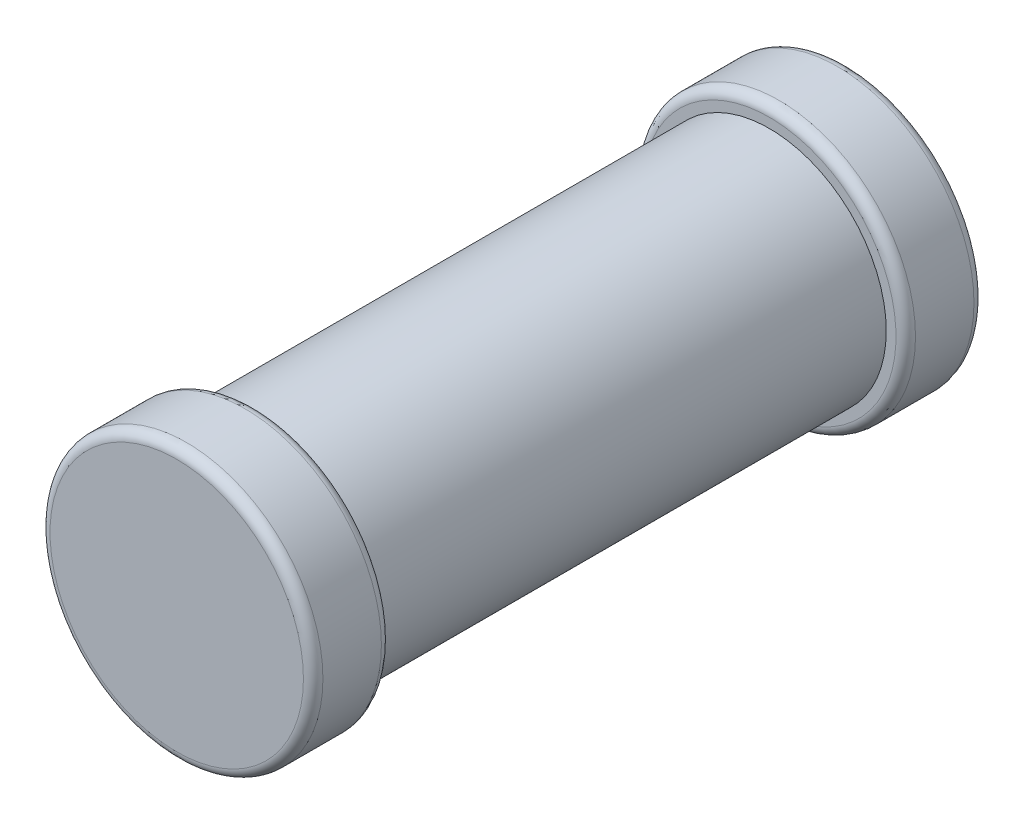
ISO-10303-21;
HEADER;
FILE_DESCRIPTION(('STEP AP214'),'2;1');
FILE_NAME('part.step','',(''),(''),'','','');
FILE_SCHEMA(('AUTOMOTIVE_DESIGN { 1 0 10303 214 1 1 1 1 }'));
ENDSEC;
DATA;
#1=APPLICATION_CONTEXT('core data for automotive mechanical design processes');
#2=APPLICATION_PROTOCOL_DEFINITION('international standard','automotive_design',2000,#1);
#3=PRODUCT_CONTEXT('',#1,'mechanical');
#4=PRODUCT('Part','Part','',(#3));
#5=PRODUCT_RELATED_PRODUCT_CATEGORY('part','',(#4));
#6=PRODUCT_DEFINITION_FORMATION('','',#4);
#7=PRODUCT_DEFINITION_CONTEXT('part definition',#1,'design');
#8=PRODUCT_DEFINITION('design','',#6,#7);
#9=PRODUCT_DEFINITION_SHAPE('','',#8);
#10=(LENGTH_UNIT() NAMED_UNIT(*) SI_UNIT(.MILLI.,.METRE.));
#11=(NAMED_UNIT(*) PLANE_ANGLE_UNIT() SI_UNIT($,.RADIAN.));
#12=(NAMED_UNIT(*) SI_UNIT($,.STERADIAN.) SOLID_ANGLE_UNIT());
#13=UNCERTAINTY_MEASURE_WITH_UNIT(LENGTH_MEASURE(1.E-05),#10,'distance_accuracy_value','');
#14=(GEOMETRIC_REPRESENTATION_CONTEXT(3) GLOBAL_UNCERTAINTY_ASSIGNED_CONTEXT((#13)) GLOBAL_UNIT_ASSIGNED_CONTEXT((#10,
#11,#12)) REPRESENTATION_CONTEXT('',''));
#15=CARTESIAN_POINT('',(0.,0.,0.));
#16=DIRECTION('',(0.,0.,1.));
#17=DIRECTION('',(1.,0.,0.));
#18=AXIS2_PLACEMENT_3D('',#15,#16,#17);
#19=CARTESIAN_POINT('',(0.,0.,-1.32));
#20=DIRECTION('',(0.,0.,1.));
#21=DIRECTION('',(1.,0.,0.));
#22=AXIS2_PLACEMENT_3D('',#19,#20,#21);
#23=CYLINDRICAL_SURFACE('',#22,0.6);
#24=CARTESIAN_POINT('',(0.,0.,-1.32));
#25=DIRECTION('',(0.,0.,-1.));
#26=DIRECTION('',(-1.,0.,0.));
#27=AXIS2_PLACEMENT_3D('',#24,#25,#26);
#28=CIRCLE('',#27,0.6);
#29=CARTESIAN_POINT('',(-0.6,0.,-1.32));
#30=VERTEX_POINT('',#29);
#31=EDGE_CURVE('E65',#30,#30,#28,.F.);
#32=ORIENTED_EDGE('',*,*,#31,.T.);
#33=EDGE_LOOP('',(#32));
#34=FACE_BOUND('',#33,.T.);
#35=CARTESIAN_POINT('',(0.,0.,1.32));
#36=DIRECTION('',(0.,0.,1.));
#37=DIRECTION('',(1.,0.,0.));
#38=AXIS2_PLACEMENT_3D('',#35,#36,#37);
#39=CIRCLE('',#38,0.6);
#40=CARTESIAN_POINT('',(0.6,0.,1.32));
#41=VERTEX_POINT('',#40);
#42=EDGE_CURVE('E62',#41,#41,#39,.T.);
#43=ORIENTED_EDGE('',*,*,#42,.F.);
#44=EDGE_LOOP('',(#43));
#45=FACE_BOUND('',#44,.T.);
#46=ADVANCED_FACE('F30',(#34,#45),#23,.T.);
#47=CARTESIAN_POINT('',(0.,0.,1.72));
#48=DIRECTION('',(0.,0.,-1.));
#49=DIRECTION('',(-1.,0.,0.));
#50=AXIS2_PLACEMENT_3D('',#47,#48,#49);
#51=CYLINDRICAL_SURFACE('',#50,0.7);
#52=CARTESIAN_POINT('',(0.,0.,1.67));
#53=DIRECTION('',(0.,0.,1.));
#54=DIRECTION('',(1.,0.,0.));
#55=AXIS2_PLACEMENT_3D('',#52,#53,#54);
#56=CIRCLE('',#55,0.7);
#57=CARTESIAN_POINT('',(0.7,0.,1.67));
#58=VERTEX_POINT('',#57);
#59=EDGE_CURVE('E53',#58,#58,#56,.F.);
#60=ORIENTED_EDGE('',*,*,#59,.T.);
#61=EDGE_LOOP('',(#60));
#62=FACE_BOUND('',#61,.T.);
#63=CARTESIAN_POINT('',(0.,0.,1.37));
#64=DIRECTION('',(0.,0.,1.));
#65=DIRECTION('',(1.,0.,0.));
#66=AXIS2_PLACEMENT_3D('',#63,#64,#65);
#67=CIRCLE('',#66,0.7);
#68=CARTESIAN_POINT('',(0.7,0.,1.37));
#69=VERTEX_POINT('',#68);
#70=EDGE_CURVE('E56',#69,#69,#67,.T.);
#71=ORIENTED_EDGE('',*,*,#70,.T.);
#72=EDGE_LOOP('',(#71));
#73=FACE_BOUND('',#72,.T.);
#74=ADVANCED_FACE('F85',(#62,#73),#51,.T.);
#75=CARTESIAN_POINT('',(0.,0.,1.72));
#76=DIRECTION('',(0.,0.,1.));
#77=DIRECTION('',(1.,0.,0.));
#78=AXIS2_PLACEMENT_3D('',#75,#76,#77);
#79=PLANE('',#78);
#80=CARTESIAN_POINT('',(0.,0.,1.72));
#81=DIRECTION('',(0.,0.,1.));
#82=DIRECTION('',(1.,0.,0.));
#83=AXIS2_PLACEMENT_3D('',#80,#81,#82);
#84=CIRCLE('',#83,0.65);
#85=CARTESIAN_POINT('',(0.65,0.,1.72));
#86=VERTEX_POINT('',#85);
#87=EDGE_CURVE('E59',#86,#86,#84,.T.);
#88=ORIENTED_EDGE('',*,*,#87,.T.);
#89=EDGE_LOOP('',(#88));
#90=FACE_BOUND('',#89,.T.);
#91=ADVANCED_FACE('F90',(#90),#79,.T.);
#92=CARTESIAN_POINT('',(0.,0.,1.32));
#93=DIRECTION('',(0.,0.,1.));
#94=DIRECTION('',(1.,0.,0.));
#95=AXIS2_PLACEMENT_3D('',#92,#93,#94);
#96=PLANE('',#95);
#97=CARTESIAN_POINT('',(0.,0.,1.32));
#98=DIRECTION('',(0.,0.,1.));
#99=DIRECTION('',(1.,0.,0.));
#100=AXIS2_PLACEMENT_3D('',#97,#98,#99);
#101=CIRCLE('',#100,0.65);
#102=CARTESIAN_POINT('',(0.65,0.,1.32));
#103=VERTEX_POINT('',#102);
#104=EDGE_CURVE('E50',#103,#103,#101,.F.);
#105=ORIENTED_EDGE('',*,*,#104,.T.);
#106=EDGE_LOOP('',(#105));
#107=FACE_BOUND('',#106,.T.);
#108=ORIENTED_EDGE('',*,*,#42,.T.);
#109=EDGE_LOOP('',(#108));
#110=FACE_BOUND('',#109,.T.);
#111=ADVANCED_FACE('F99',(#107,#110),#96,.F.);
#112=CARTESIAN_POINT('',(0.,0.,1.67));
#113=DIRECTION('',(0.,0.,1.));
#114=DIRECTION('',(1.,0.,0.));
#115=AXIS2_PLACEMENT_3D('',#112,#113,#114);
#116=TOROIDAL_SURFACE('',#115,0.65,0.05);
#117=ORIENTED_EDGE('',*,*,#59,.F.);
#118=EDGE_LOOP('',(#117));
#119=FACE_BOUND('',#118,.T.);
#120=ORIENTED_EDGE('',*,*,#87,.F.);
#121=EDGE_LOOP('',(#120));
#122=FACE_BOUND('',#121,.T.);
#123=ADVANCED_FACE('F95',(#119,#122),#116,.T.);
#124=CARTESIAN_POINT('',(0.,0.,1.37));
#125=DIRECTION('',(0.,0.,1.));
#126=DIRECTION('',(1.,0.,0.));
#127=AXIS2_PLACEMENT_3D('',#124,#125,#126);
#128=TOROIDAL_SURFACE('',#127,0.65,0.05);
#129=ORIENTED_EDGE('',*,*,#104,.F.);
#130=EDGE_LOOP('',(#129));
#131=FACE_BOUND('',#130,.T.);
#132=ORIENTED_EDGE('',*,*,#70,.F.);
#133=EDGE_LOOP('',(#132));
#134=FACE_BOUND('',#133,.T.);
#135=ADVANCED_FACE('F98',(#131,#134),#128,.T.);
#136=CARTESIAN_POINT('',(0.,0.,-1.72));
#137=DIRECTION('',(0.,0.,1.));
#138=DIRECTION('',(1.,0.,0.));
#139=AXIS2_PLACEMENT_3D('',#136,#137,#138);
#140=CYLINDRICAL_SURFACE('',#139,0.7);
#141=CARTESIAN_POINT('',(0.,0.,-1.67));
#142=DIRECTION('',(0.,0.,-1.));
#143=DIRECTION('',(-1.,0.,0.));
#144=AXIS2_PLACEMENT_3D('',#141,#142,#143);
#145=CIRCLE('',#144,0.7);
#146=CARTESIAN_POINT('',(-0.7,0.,-1.67));
#147=VERTEX_POINT('',#146);
#148=EDGE_CURVE('E41',#147,#147,#145,.F.);
#149=ORIENTED_EDGE('',*,*,#148,.T.);
#150=EDGE_LOOP('',(#149));
#151=FACE_BOUND('',#150,.T.);
#152=CARTESIAN_POINT('',(0.,0.,-1.37));
#153=DIRECTION('',(0.,0.,-1.));
#154=DIRECTION('',(-1.,0.,0.));
#155=AXIS2_PLACEMENT_3D('',#152,#153,#154);
#156=CIRCLE('',#155,0.7);
#157=CARTESIAN_POINT('',(-0.7,0.,-1.37));
#158=VERTEX_POINT('',#157);
#159=EDGE_CURVE('E45',#158,#158,#156,.T.);
#160=ORIENTED_EDGE('',*,*,#159,.T.);
#161=EDGE_LOOP('',(#160));
#162=FACE_BOUND('',#161,.T.);
#163=ADVANCED_FACE('F81',(#151,#162),#140,.T.);
#164=CARTESIAN_POINT('',(0.,0.,-1.72));
#165=DIRECTION('',(0.,0.,-1.));
#166=DIRECTION('',(1.,0.,0.));
#167=AXIS2_PLACEMENT_3D('',#164,#165,#166);
#168=PLANE('',#167);
#169=CARTESIAN_POINT('',(0.,0.,-1.72));
#170=DIRECTION('',(0.,0.,-1.));
#171=DIRECTION('',(-1.,0.,0.));
#172=AXIS2_PLACEMENT_3D('',#169,#170,#171);
#173=CIRCLE('',#172,0.65);
#174=CARTESIAN_POINT('',(-0.65,0.,-1.72));
#175=VERTEX_POINT('',#174);
#176=EDGE_CURVE('E37',#175,#175,#173,.T.);
#177=ORIENTED_EDGE('',*,*,#176,.T.);
#178=EDGE_LOOP('',(#177));
#179=FACE_BOUND('',#178,.T.);
#180=ADVANCED_FACE('F74',(#179),#168,.T.);
#181=CARTESIAN_POINT('',(0.,0.,-1.32));
#182=DIRECTION('',(0.,0.,-1.));
#183=DIRECTION('',(1.,0.,0.));
#184=AXIS2_PLACEMENT_3D('',#181,#182,#183);
#185=PLANE('',#184);
#186=CARTESIAN_POINT('',(0.,0.,-1.32));
#187=DIRECTION('',(0.,0.,-1.));
#188=DIRECTION('',(-1.,0.,0.));
#189=AXIS2_PLACEMENT_3D('',#186,#187,#188);
#190=CIRCLE('',#189,0.65);
#191=CARTESIAN_POINT('',(-0.65,0.,-1.32));
#192=VERTEX_POINT('',#191);
#193=EDGE_CURVE('E10',#192,#192,#190,.F.);
#194=ORIENTED_EDGE('',*,*,#193,.T.);
#195=EDGE_LOOP('',(#194));
#196=FACE_BOUND('',#195,.T.);
#197=ORIENTED_EDGE('',*,*,#31,.F.);
#198=EDGE_LOOP('',(#197));
#199=FACE_BOUND('',#198,.T.);
#200=ADVANCED_FACE('F71',(#196,#199),#185,.F.);
#201=CARTESIAN_POINT('',(0.,0.,-1.67));
#202=DIRECTION('',(0.,0.,-1.));
#203=DIRECTION('',(-1.,0.,0.));
#204=AXIS2_PLACEMENT_3D('',#201,#202,#203);
#205=TOROIDAL_SURFACE('',#204,0.65,0.05);
#206=ORIENTED_EDGE('',*,*,#176,.F.);
#207=EDGE_LOOP('',(#206));
#208=FACE_BOUND('',#207,.T.);
#209=ORIENTED_EDGE('',*,*,#148,.F.);
#210=EDGE_LOOP('',(#209));
#211=FACE_BOUND('',#210,.T.);
#212=ADVANCED_FACE('F73',(#208,#211),#205,.T.);
#213=CARTESIAN_POINT('',(0.,0.,-1.37));
#214=DIRECTION('',(0.,0.,-1.));
#215=DIRECTION('',(-1.,0.,0.));
#216=AXIS2_PLACEMENT_3D('',#213,#214,#215);
#217=TOROIDAL_SURFACE('',#216,0.65,0.05);
#218=ORIENTED_EDGE('',*,*,#159,.F.);
#219=EDGE_LOOP('',(#218));
#220=FACE_BOUND('',#219,.T.);
#221=ORIENTED_EDGE('',*,*,#193,.F.);
#222=EDGE_LOOP('',(#221));
#223=FACE_BOUND('',#222,.T.);
#224=ADVANCED_FACE('F32',(#220,#223),#217,.T.);
#225=CLOSED_SHELL('',(#46,#74,#91,#111,#123,#135,#163,#180,#200,#212,#224));
#226=MANIFOLD_SOLID_BREP('B2',#225);
#227=ADVANCED_BREP_SHAPE_REPRESENTATION('',(#18,#226),#14);
#228=SHAPE_DEFINITION_REPRESENTATION(#9,#227);
ENDSEC;
END-ISO-10303-21;
